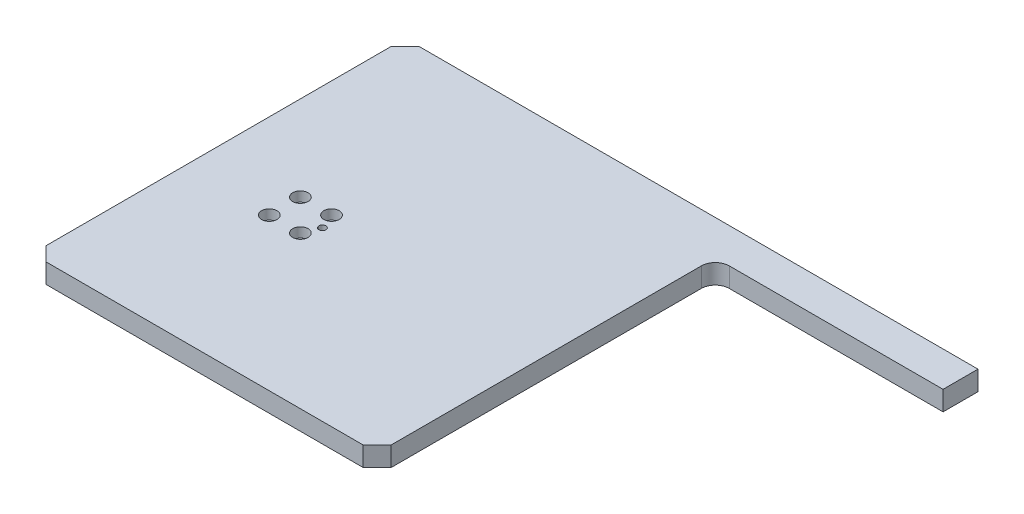
ISO-10303-21;
HEADER;
FILE_DESCRIPTION(('STEP AP214'),'2;1');
FILE_NAME('part.step','',(''),(''),'','','');
FILE_SCHEMA(('AUTOMOTIVE_DESIGN { 1 0 10303 214 1 1 1 1 }'));
ENDSEC;
DATA;
#1=APPLICATION_CONTEXT('core data for automotive mechanical design processes');
#2=APPLICATION_PROTOCOL_DEFINITION('international standard','automotive_design',2000,#1);
#3=PRODUCT_CONTEXT('',#1,'mechanical');
#4=PRODUCT('Part','Part','',(#3));
#5=PRODUCT_RELATED_PRODUCT_CATEGORY('part','',(#4));
#6=PRODUCT_DEFINITION_FORMATION('','',#4);
#7=PRODUCT_DEFINITION_CONTEXT('part definition',#1,'design');
#8=PRODUCT_DEFINITION('design','',#6,#7);
#9=PRODUCT_DEFINITION_SHAPE('','',#8);
#10=(LENGTH_UNIT() NAMED_UNIT(*) SI_UNIT(.MILLI.,.METRE.));
#11=(NAMED_UNIT(*) PLANE_ANGLE_UNIT() SI_UNIT($,.RADIAN.));
#12=(NAMED_UNIT(*) SI_UNIT($,.STERADIAN.) SOLID_ANGLE_UNIT());
#13=UNCERTAINTY_MEASURE_WITH_UNIT(LENGTH_MEASURE(1.E-05),#10,'distance_accuracy_value','');
#14=(GEOMETRIC_REPRESENTATION_CONTEXT(3) GLOBAL_UNCERTAINTY_ASSIGNED_CONTEXT((#13)) GLOBAL_UNIT_ASSIGNED_CONTEXT((#10,
#11,#12)) REPRESENTATION_CONTEXT('',''));
#15=CARTESIAN_POINT('',(0.,0.,0.));
#16=DIRECTION('',(0.,0.,1.));
#17=DIRECTION('',(1.,0.,0.));
#18=AXIS2_PLACEMENT_3D('',#15,#16,#17);
#19=CARTESIAN_POINT('',(337.94,14.,-122.));
#20=DIRECTION('',(0.,0.,-1.));
#21=DIRECTION('',(-1.,0.,0.));
#22=AXIS2_PLACEMENT_3D('',#19,#20,#21);
#23=PLANE('',#22);
#24=DIRECTION('',(1.,0.,0.));
#25=VECTOR('',#24,1.);
#26=CARTESIAN_POINT('',(337.94,0.,-122.));
#27=LINE('',#26,#25);
#28=CARTESIAN_POINT('',(184.94,0.,-122.));
#29=VERTEX_POINT('',#28);
#30=CARTESIAN_POINT('',(337.94,0.,-122.));
#31=VERTEX_POINT('',#30);
#32=EDGE_CURVE('E145',#29,#31,#27,.T.);
#33=ORIENTED_EDGE('',*,*,#32,.T.);
#34=DIRECTION('',(0.,-1.,0.));
#35=VECTOR('',#34,1.);
#36=CARTESIAN_POINT('',(337.94,14.,-122.));
#37=LINE('',#36,#35);
#38=CARTESIAN_POINT('',(337.94,14.,-122.));
#39=VERTEX_POINT('',#38);
#40=EDGE_CURVE('E11',#39,#31,#37,.T.);
#41=ORIENTED_EDGE('',*,*,#40,.F.);
#42=DIRECTION('',(1.,0.,0.));
#43=VECTOR('',#42,1.);
#44=CARTESIAN_POINT('',(337.94,14.,-122.));
#45=LINE('',#44,#43);
#46=CARTESIAN_POINT('',(184.94,14.,-122.));
#47=VERTEX_POINT('',#46);
#48=EDGE_CURVE('E164',#47,#39,#45,.T.);
#49=ORIENTED_EDGE('',*,*,#48,.F.);
#50=DIRECTION('',(0.,-1.,0.));
#51=VECTOR('',#50,1.);
#52=CARTESIAN_POINT('',(184.94,14.,-122.));
#53=LINE('',#52,#51);
#54=EDGE_CURVE('E141',#47,#29,#53,.T.);
#55=ORIENTED_EDGE('',*,*,#54,.T.);
#56=EDGE_LOOP('',(#33,#41,#49,#55));
#57=FACE_BOUND('',#56,.T.);
#58=ADVANCED_FACE('F35',(#57),#23,.F.);
#59=CARTESIAN_POINT('',(337.94,14.,-147.));
#60=DIRECTION('',(-1.,0.,0.));
#61=DIRECTION('',(0.,0.,1.));
#62=AXIS2_PLACEMENT_3D('',#59,#60,#61);
#63=PLANE('',#62);
#64=DIRECTION('',(0.,0.,-1.));
#65=VECTOR('',#64,1.);
#66=CARTESIAN_POINT('',(337.94,0.,-147.));
#67=LINE('',#66,#65);
#68=CARTESIAN_POINT('',(337.94,0.,-147.));
#69=VERTEX_POINT('',#68);
#70=EDGE_CURVE('E148',#31,#69,#67,.T.);
#71=ORIENTED_EDGE('',*,*,#70,.T.);
#72=DIRECTION('',(0.,-1.,0.));
#73=VECTOR('',#72,1.);
#74=CARTESIAN_POINT('',(337.94,14.,-147.));
#75=LINE('',#74,#73);
#76=CARTESIAN_POINT('',(337.94,14.,-147.));
#77=VERTEX_POINT('',#76);
#78=EDGE_CURVE('E44',#77,#69,#75,.T.);
#79=ORIENTED_EDGE('',*,*,#78,.F.);
#80=DIRECTION('',(0.,0.,-1.));
#81=VECTOR('',#80,1.);
#82=CARTESIAN_POINT('',(337.94,14.,-147.));
#83=LINE('',#82,#81);
#84=EDGE_CURVE('E102',#39,#77,#83,.T.);
#85=ORIENTED_EDGE('',*,*,#84,.F.);
#86=ORIENTED_EDGE('',*,*,#40,.T.);
#87=EDGE_LOOP('',(#71,#79,#85,#86));
#88=FACE_BOUND('',#87,.T.);
#89=ADVANCED_FACE('F263',(#88),#63,.F.);
#90=CARTESIAN_POINT('',(-62.06,14.,-147.));
#91=DIRECTION('',(0.,0.,1.));
#92=DIRECTION('',(1.,0.,0.));
#93=AXIS2_PLACEMENT_3D('',#90,#91,#92);
#94=PLANE('',#93);
#95=DIRECTION('',(-1.,0.,0.));
#96=VECTOR('',#95,1.);
#97=CARTESIAN_POINT('',(-62.06,0.,-147.));
#98=LINE('',#97,#96);
#99=CARTESIAN_POINT('',(-62.06,0.,-147.));
#100=VERTEX_POINT('',#99);
#101=EDGE_CURVE('E151',#69,#100,#98,.T.);
#102=ORIENTED_EDGE('',*,*,#101,.T.);
#103=DIRECTION('',(0.,-1.,0.));
#104=VECTOR('',#103,1.);
#105=CARTESIAN_POINT('',(-62.06,14.,-147.));
#106=LINE('',#105,#104);
#107=CARTESIAN_POINT('',(-62.06,14.,-147.));
#108=VERTEX_POINT('',#107);
#109=EDGE_CURVE('E177',#108,#100,#106,.T.);
#110=ORIENTED_EDGE('',*,*,#109,.F.);
#111=DIRECTION('',(-1.,0.,0.));
#112=VECTOR('',#111,1.);
#113=CARTESIAN_POINT('',(-62.06,14.,-147.));
#114=LINE('',#113,#112);
#115=EDGE_CURVE('E227',#77,#108,#114,.T.);
#116=ORIENTED_EDGE('',*,*,#115,.F.);
#117=ORIENTED_EDGE('',*,*,#78,.T.);
#118=EDGE_LOOP('',(#102,#110,#116,#117));
#119=FACE_BOUND('',#118,.T.);
#120=ADVANCED_FACE('F267',(#119),#94,.F.);
#121=CARTESIAN_POINT('',(-72.06,14.,-137.));
#122=DIRECTION('',(0.707106781186548,0.,0.707106781186547));
#123=DIRECTION('',(0.707106781186547,0.,-0.707106781186548));
#124=AXIS2_PLACEMENT_3D('',#121,#122,#123);
#125=PLANE('',#124);
#126=DIRECTION('',(-0.707106781186547,0.,0.707106781186548));
#127=VECTOR('',#126,1.);
#128=CARTESIAN_POINT('',(-72.06,0.,-137.));
#129=LINE('',#128,#127);
#130=CARTESIAN_POINT('',(-72.06,0.,-137.));
#131=VERTEX_POINT('',#130);
#132=EDGE_CURVE('E153',#100,#131,#129,.T.);
#133=ORIENTED_EDGE('',*,*,#132,.T.);
#134=DIRECTION('',(0.,-1.,0.));
#135=VECTOR('',#134,1.);
#136=CARTESIAN_POINT('',(-72.06,14.,-137.));
#137=LINE('',#136,#135);
#138=CARTESIAN_POINT('',(-72.06,14.,-137.));
#139=VERTEX_POINT('',#138);
#140=EDGE_CURVE('E174',#139,#131,#137,.T.);
#141=ORIENTED_EDGE('',*,*,#140,.F.);
#142=DIRECTION('',(-0.707106781186547,0.,0.707106781186548));
#143=VECTOR('',#142,1.);
#144=CARTESIAN_POINT('',(-72.06,14.,-137.));
#145=LINE('',#144,#143);
#146=EDGE_CURVE('E229',#108,#139,#145,.T.);
#147=ORIENTED_EDGE('',*,*,#146,.F.);
#148=ORIENTED_EDGE('',*,*,#109,.T.);
#149=EDGE_LOOP('',(#133,#141,#147,#148));
#150=FACE_BOUND('',#149,.T.);
#151=ADVANCED_FACE('F271',(#150),#125,.F.);
#152=CARTESIAN_POINT('',(-72.06,14.,-137.));
#153=DIRECTION('',(1.,0.,0.));
#154=DIRECTION('',(0.,0.,-1.));
#155=AXIS2_PLACEMENT_3D('',#152,#153,#154);
#156=PLANE('',#155);
#157=DIRECTION('',(0.,0.,1.));
#158=VECTOR('',#157,1.);
#159=CARTESIAN_POINT('',(-72.06,0.,-137.));
#160=LINE('',#159,#158);
#161=CARTESIAN_POINT('',(-72.06,0.,110.));
#162=VERTEX_POINT('',#161);
#163=EDGE_CURVE('E155',#131,#162,#160,.T.);
#164=ORIENTED_EDGE('',*,*,#163,.T.);
#165=DIRECTION('',(0.,-1.,0.));
#166=VECTOR('',#165,1.);
#167=CARTESIAN_POINT('',(-72.06,14.,110.));
#168=LINE('',#167,#166);
#169=CARTESIAN_POINT('',(-72.06,14.,110.));
#170=VERTEX_POINT('',#169);
#171=EDGE_CURVE('E171',#170,#162,#168,.T.);
#172=ORIENTED_EDGE('',*,*,#171,.F.);
#173=DIRECTION('',(0.,0.,1.));
#174=VECTOR('',#173,1.);
#175=CARTESIAN_POINT('',(-72.06,14.,-137.));
#176=LINE('',#175,#174);
#177=EDGE_CURVE('E231',#139,#170,#176,.T.);
#178=ORIENTED_EDGE('',*,*,#177,.F.);
#179=ORIENTED_EDGE('',*,*,#140,.T.);
#180=EDGE_LOOP('',(#164,#172,#178,#179));
#181=FACE_BOUND('',#180,.T.);
#182=ADVANCED_FACE('F277',(#181),#156,.F.);
#183=CARTESIAN_POINT('',(-72.06,14.,110.));
#184=DIRECTION('',(0.707106781186547,0.,-0.707106781186548));
#185=DIRECTION('',(-0.707106781186548,0.,-0.707106781186547));
#186=AXIS2_PLACEMENT_3D('',#183,#184,#185);
#187=PLANE('',#186);
#188=DIRECTION('',(0.707106781186548,0.,0.707106781186547));
#189=VECTOR('',#188,1.);
#190=CARTESIAN_POINT('',(-72.06,0.,110.));
#191=LINE('',#190,#189);
#192=CARTESIAN_POINT('',(-62.06,0.,120.));
#193=VERTEX_POINT('',#192);
#194=EDGE_CURVE('E157',#162,#193,#191,.T.);
#195=ORIENTED_EDGE('',*,*,#194,.T.);
#196=DIRECTION('',(0.,-1.,0.));
#197=VECTOR('',#196,1.);
#198=CARTESIAN_POINT('',(-62.06,14.,120.));
#199=LINE('',#198,#197);
#200=CARTESIAN_POINT('',(-62.06,14.,120.));
#201=VERTEX_POINT('',#200);
#202=EDGE_CURVE('E168',#201,#193,#199,.T.);
#203=ORIENTED_EDGE('',*,*,#202,.F.);
#204=DIRECTION('',(0.707106781186548,0.,0.707106781186547));
#205=VECTOR('',#204,1.);
#206=CARTESIAN_POINT('',(-72.06,14.,110.));
#207=LINE('',#206,#205);
#208=EDGE_CURVE('E233',#170,#201,#207,.T.);
#209=ORIENTED_EDGE('',*,*,#208,.F.);
#210=ORIENTED_EDGE('',*,*,#171,.T.);
#211=EDGE_LOOP('',(#195,#203,#209,#210));
#212=FACE_BOUND('',#211,.T.);
#213=ADVANCED_FACE('F239',(#212),#187,.F.);
#214=CARTESIAN_POINT('',(164.94,14.,120.));
#215=DIRECTION('',(0.,0.,-1.));
#216=DIRECTION('',(-1.,0.,0.));
#217=AXIS2_PLACEMENT_3D('',#214,#215,#216);
#218=PLANE('',#217);
#219=DIRECTION('',(1.,0.,0.));
#220=VECTOR('',#219,1.);
#221=CARTESIAN_POINT('',(164.94,0.,120.));
#222=LINE('',#221,#220);
#223=CARTESIAN_POINT('',(164.94,0.,120.));
#224=VERTEX_POINT('',#223);
#225=EDGE_CURVE('E159',#193,#224,#222,.T.);
#226=ORIENTED_EDGE('',*,*,#225,.T.);
#227=DIRECTION('',(0.,-1.,0.));
#228=VECTOR('',#227,1.);
#229=CARTESIAN_POINT('',(164.94,14.,120.));
#230=LINE('',#229,#228);
#231=CARTESIAN_POINT('',(164.94,14.,120.));
#232=VERTEX_POINT('',#231);
#233=EDGE_CURVE('E136',#232,#224,#230,.T.);
#234=ORIENTED_EDGE('',*,*,#233,.F.);
#235=DIRECTION('',(1.,0.,0.));
#236=VECTOR('',#235,1.);
#237=CARTESIAN_POINT('',(164.94,14.,120.));
#238=LINE('',#237,#236);
#239=EDGE_CURVE('E127',#201,#232,#238,.T.);
#240=ORIENTED_EDGE('',*,*,#239,.F.);
#241=ORIENTED_EDGE('',*,*,#202,.T.);
#242=EDGE_LOOP('',(#226,#234,#240,#241));
#243=FACE_BOUND('',#242,.T.);
#244=ADVANCED_FACE('F243',(#243),#218,.F.);
#245=CARTESIAN_POINT('',(174.94,14.,110.));
#246=DIRECTION('',(-0.707106781186548,0.,-0.707106781186548));
#247=DIRECTION('',(-0.707106781186548,0.,0.707106781186548));
#248=AXIS2_PLACEMENT_3D('',#245,#246,#247);
#249=PLANE('',#248);
#250=DIRECTION('',(0.707106781186547,0.,-0.707106781186547));
#251=VECTOR('',#250,1.);
#252=CARTESIAN_POINT('',(174.94,0.,110.));
#253=LINE('',#252,#251);
#254=CARTESIAN_POINT('',(174.94,0.,110.));
#255=VERTEX_POINT('',#254);
#256=EDGE_CURVE('E135',#224,#255,#253,.T.);
#257=ORIENTED_EDGE('',*,*,#256,.T.);
#258=DIRECTION('',(0.,-1.,0.));
#259=VECTOR('',#258,1.);
#260=CARTESIAN_POINT('',(174.94,14.,110.));
#261=LINE('',#260,#259);
#262=CARTESIAN_POINT('',(174.94,14.,110.));
#263=VERTEX_POINT('',#262);
#264=EDGE_CURVE('E132',#263,#255,#261,.T.);
#265=ORIENTED_EDGE('',*,*,#264,.F.);
#266=DIRECTION('',(0.707106781186547,0.,-0.707106781186547));
#267=VECTOR('',#266,1.);
#268=CARTESIAN_POINT('',(174.94,14.,110.));
#269=LINE('',#268,#267);
#270=EDGE_CURVE('E121',#232,#263,#269,.T.);
#271=ORIENTED_EDGE('',*,*,#270,.F.);
#272=ORIENTED_EDGE('',*,*,#233,.T.);
#273=EDGE_LOOP('',(#257,#265,#271,#272));
#274=FACE_BOUND('',#273,.T.);
#275=ADVANCED_FACE('F133',(#274),#249,.F.);
#276=CARTESIAN_POINT('',(174.94,14.,-112.));
#277=DIRECTION('',(-1.,0.,0.));
#278=DIRECTION('',(0.,0.,1.));
#279=AXIS2_PLACEMENT_3D('',#276,#277,#278);
#280=PLANE('',#279);
#281=DIRECTION('',(0.,0.,-1.));
#282=VECTOR('',#281,1.);
#283=CARTESIAN_POINT('',(174.94,0.,-112.));
#284=LINE('',#283,#282);
#285=CARTESIAN_POINT('',(174.94,0.,-112.));
#286=VERTEX_POINT('',#285);
#287=EDGE_CURVE('E88',#255,#286,#284,.T.);
#288=ORIENTED_EDGE('',*,*,#287,.T.);
#289=DIRECTION('',(0.,-1.,0.));
#290=VECTOR('',#289,1.);
#291=CARTESIAN_POINT('',(174.94,14.,-112.));
#292=LINE('',#291,#290);
#293=CARTESIAN_POINT('',(174.94,14.,-112.));
#294=VERTEX_POINT('',#293);
#295=EDGE_CURVE('E137',#294,#286,#292,.T.);
#296=ORIENTED_EDGE('',*,*,#295,.F.);
#297=DIRECTION('',(0.,0.,-1.));
#298=VECTOR('',#297,1.);
#299=CARTESIAN_POINT('',(174.94,14.,-112.));
#300=LINE('',#299,#298);
#301=EDGE_CURVE('E125',#263,#294,#300,.T.);
#302=ORIENTED_EDGE('',*,*,#301,.F.);
#303=ORIENTED_EDGE('',*,*,#264,.T.);
#304=EDGE_LOOP('',(#288,#296,#302,#303));
#305=FACE_BOUND('',#304,.T.);
#306=ADVANCED_FACE('F139',(#305),#280,.F.);
#307=CARTESIAN_POINT('',(184.94,14.,-112.));
#308=DIRECTION('',(0.,-1.,0.));
#309=DIRECTION('',(0.,0.,-1.));
#310=AXIS2_PLACEMENT_3D('',#307,#308,#309);
#311=CYLINDRICAL_SURFACE('',#310,9.99999999999998);
#312=CARTESIAN_POINT('',(184.94,0.,-112.));
#313=DIRECTION('',(0.,-1.,0.));
#314=DIRECTION('',(0.,0.,1.));
#315=AXIS2_PLACEMENT_3D('',#312,#313,#314);
#316=CIRCLE('',#315,9.99999999999998);
#317=EDGE_CURVE('E94',#286,#29,#316,.T.);
#318=ORIENTED_EDGE('',*,*,#317,.T.);
#319=ORIENTED_EDGE('',*,*,#54,.F.);
#320=CARTESIAN_POINT('',(184.94,14.,-112.));
#321=DIRECTION('',(0.,-1.,0.));
#322=DIRECTION('',(0.,0.,1.));
#323=AXIS2_PLACEMENT_3D('',#320,#321,#322);
#324=CIRCLE('',#323,9.99999999999998);
#325=EDGE_CURVE('E53',#294,#47,#324,.T.);
#326=ORIENTED_EDGE('',*,*,#325,.F.);
#327=ORIENTED_EDGE('',*,*,#295,.T.);
#328=EDGE_LOOP('',(#318,#319,#326,#327));
#329=FACE_BOUND('',#328,.T.);
#330=ADVANCED_FACE('F251',(#329),#311,.F.);
#331=CARTESIAN_POINT('',(184.94,14.,-112.));
#332=DIRECTION('',(0.,1.,0.));
#333=DIRECTION('',(0.,0.,1.));
#334=AXIS2_PLACEMENT_3D('',#331,#332,#333);
#335=PLANE('',#334);
#336=CARTESIAN_POINT('',(15.75,14.,0.));
#337=DIRECTION('',(0.,-1.,0.));
#338=DIRECTION('',(0.,0.,-1.));
#339=AXIS2_PLACEMENT_3D('',#336,#337,#338);
#340=CIRCLE('',#339,2.5);
#341=CARTESIAN_POINT('',(15.75,14.,-2.5));
#342=VERTEX_POINT('',#341);
#343=EDGE_CURVE('E469',#342,#342,#340,.T.);
#344=ORIENTED_EDGE('',*,*,#343,.T.);
#345=EDGE_LOOP('',(#344));
#346=FACE_BOUND('',#345,.T.);
#347=CARTESIAN_POINT('',(-11.1369318036881,14.,11.1369318036881));
#348=DIRECTION('',(0.,1.,0.));
#349=DIRECTION('',(0.,0.,1.));
#350=AXIS2_PLACEMENT_3D('',#347,#348,#349);
#351=CIRCLE('',#350,5.5000017);
#352=CARTESIAN_POINT('',(-11.1369318036881,14.,16.6369335036881));
#353=VERTEX_POINT('',#352);
#354=EDGE_CURVE('E474',#353,#353,#351,.T.);
#355=ORIENTED_EDGE('',*,*,#354,.F.);
#356=EDGE_LOOP('',(#355));
#357=FACE_BOUND('',#356,.T.);
#358=CARTESIAN_POINT('',(11.1369318036881,14.,11.1369318036881));
#359=DIRECTION('',(0.,1.,0.));
#360=DIRECTION('',(0.,0.,1.));
#361=AXIS2_PLACEMENT_3D('',#358,#359,#360);
#362=CIRCLE('',#361,5.5000017);
#363=CARTESIAN_POINT('',(11.1369318036881,14.,16.6369335036881));
#364=VERTEX_POINT('',#363);
#365=EDGE_CURVE('E206',#364,#364,#362,.T.);
#366=ORIENTED_EDGE('',*,*,#365,.F.);
#367=EDGE_LOOP('',(#366));
#368=FACE_BOUND('',#367,.T.);
#369=CARTESIAN_POINT('',(11.1369318036881,14.,-11.1369318036881));
#370=DIRECTION('',(0.,1.,0.));
#371=DIRECTION('',(0.,0.,1.));
#372=AXIS2_PLACEMENT_3D('',#369,#370,#371);
#373=CIRCLE('',#372,5.5000017);
#374=CARTESIAN_POINT('',(11.1369318036881,14.,-5.63693010368812));
#375=VERTEX_POINT('',#374);
#376=EDGE_CURVE('E193',#375,#375,#373,.T.);
#377=ORIENTED_EDGE('',*,*,#376,.F.);
#378=EDGE_LOOP('',(#377));
#379=FACE_BOUND('',#378,.T.);
#380=CARTESIAN_POINT('',(-11.1369318036881,14.,-11.1369318036881));
#381=DIRECTION('',(0.,1.,0.));
#382=DIRECTION('',(0.,0.,1.));
#383=AXIS2_PLACEMENT_3D('',#380,#381,#382);
#384=CIRCLE('',#383,5.5000017);
#385=CARTESIAN_POINT('',(-11.1369318036881,14.,-5.63693010368812));
#386=VERTEX_POINT('',#385);
#387=EDGE_CURVE('E189',#386,#386,#384,.T.);
#388=ORIENTED_EDGE('',*,*,#387,.F.);
#389=EDGE_LOOP('',(#388));
#390=FACE_BOUND('',#389,.T.);
#391=ORIENTED_EDGE('',*,*,#48,.T.);
#392=ORIENTED_EDGE('',*,*,#84,.T.);
#393=ORIENTED_EDGE('',*,*,#115,.T.);
#394=ORIENTED_EDGE('',*,*,#146,.T.);
#395=ORIENTED_EDGE('',*,*,#177,.T.);
#396=ORIENTED_EDGE('',*,*,#208,.T.);
#397=ORIENTED_EDGE('',*,*,#239,.T.);
#398=ORIENTED_EDGE('',*,*,#270,.T.);
#399=ORIENTED_EDGE('',*,*,#301,.T.);
#400=ORIENTED_EDGE('',*,*,#325,.T.);
#401=EDGE_LOOP('',(#391,#392,#393,#394,#395,#396,#397,#398,#399,#400));
#402=FACE_BOUND('',#401,.T.);
#403=ADVANCED_FACE('F123',(#346,#357,#368,#379,#390,#402),#335,.T.);
#404=CARTESIAN_POINT('',(184.94,0.,-112.));
#405=DIRECTION('',(0.,1.,0.));
#406=DIRECTION('',(0.,0.,1.));
#407=AXIS2_PLACEMENT_3D('',#404,#405,#406);
#408=PLANE('',#407);
#409=CARTESIAN_POINT('',(0.,0.,0.));
#410=DIRECTION('',(0.,1.,0.));
#411=DIRECTION('',(0.,0.,1.));
#412=AXIS2_PLACEMENT_3D('',#409,#410,#411);
#413=CIRCLE('',#412,20.);
#414=CARTESIAN_POINT('',(0.,0.,-20.));
#415=VERTEX_POINT('',#414);
#416=EDGE_CURVE('E185',#415,#415,#413,.T.);
#417=ORIENTED_EDGE('',*,*,#416,.T.);
#418=EDGE_LOOP('',(#417));
#419=FACE_BOUND('',#418,.T.);
#420=ORIENTED_EDGE('',*,*,#32,.F.);
#421=ORIENTED_EDGE('',*,*,#317,.F.);
#422=ORIENTED_EDGE('',*,*,#287,.F.);
#423=ORIENTED_EDGE('',*,*,#256,.F.);
#424=ORIENTED_EDGE('',*,*,#225,.F.);
#425=ORIENTED_EDGE('',*,*,#194,.F.);
#426=ORIENTED_EDGE('',*,*,#163,.F.);
#427=ORIENTED_EDGE('',*,*,#132,.F.);
#428=ORIENTED_EDGE('',*,*,#101,.F.);
#429=ORIENTED_EDGE('',*,*,#70,.F.);
#430=EDGE_LOOP('',(#420,#421,#422,#423,#424,#425,#426,#427,#428,#429));
#431=FACE_BOUND('',#430,.T.);
#432=ADVANCED_FACE('F246',(#419,#431),#408,.F.);
#433=CARTESIAN_POINT('',(0.,2.28,0.));
#434=DIRECTION('',(0.,-1.,0.));
#435=DIRECTION('',(0.,0.,-1.));
#436=AXIS2_PLACEMENT_3D('',#433,#434,#435);
#437=CYLINDRICAL_SURFACE('',#436,20.);
#438=CARTESIAN_POINT('',(0.,2.28,0.));
#439=DIRECTION('',(0.,1.,0.));
#440=DIRECTION('',(0.,0.,1.));
#441=AXIS2_PLACEMENT_3D('',#438,#439,#440);
#442=CIRCLE('',#441,20.);
#443=CARTESIAN_POINT('',(0.,2.28,-20.));
#444=VERTEX_POINT('',#443);
#445=EDGE_CURVE('E149',#444,#444,#442,.T.);
#446=CARTESIAN_POINT('',(0.,2.28,-20.));
#447=CARTESIAN_POINT('',(0.,2.25625,-20.));
#448=CARTESIAN_POINT('',(0.,2.2325,-20.));
#449=CARTESIAN_POINT('',(0.,2.185,-20.));
#450=CARTESIAN_POINT('',(0.,2.16125,-20.));
#451=CARTESIAN_POINT('',(0.,2.11375,-20.));
#452=CARTESIAN_POINT('',(0.,2.09,-20.));
#453=CARTESIAN_POINT('',(0.,2.0425,-20.));
#454=CARTESIAN_POINT('',(0.,2.01875,-20.));
#455=CARTESIAN_POINT('',(0.,1.97125,-20.));
#456=CARTESIAN_POINT('',(0.,1.9475,-20.));
#457=CARTESIAN_POINT('',(0.,1.9,-20.));
#458=CARTESIAN_POINT('',(0.,1.87625,-20.));
#459=CARTESIAN_POINT('',(0.,1.82875,-20.));
#460=CARTESIAN_POINT('',(0.,1.805,-20.));
#461=CARTESIAN_POINT('',(0.,1.7575,-20.));
#462=CARTESIAN_POINT('',(0.,1.73375,-20.));
#463=CARTESIAN_POINT('',(0.,1.68625,-20.));
#464=CARTESIAN_POINT('',(0.,1.6625,-20.));
#465=CARTESIAN_POINT('',(0.,1.615,-20.));
#466=CARTESIAN_POINT('',(0.,1.59125,-20.));
#467=CARTESIAN_POINT('',(0.,1.54375,-20.));
#468=CARTESIAN_POINT('',(0.,1.52,-20.));
#469=CARTESIAN_POINT('',(0.,1.4725,-20.));
#470=CARTESIAN_POINT('',(0.,1.44875,-20.));
#471=CARTESIAN_POINT('',(0.,1.40125,-20.));
#472=CARTESIAN_POINT('',(0.,1.3775,-20.));
#473=CARTESIAN_POINT('',(0.,1.33,-20.));
#474=CARTESIAN_POINT('',(0.,1.30625,-20.));
#475=CARTESIAN_POINT('',(0.,1.25875,-20.));
#476=CARTESIAN_POINT('',(0.,1.235,-20.));
#477=CARTESIAN_POINT('',(0.,1.1875,-20.));
#478=CARTESIAN_POINT('',(0.,1.16375,-20.));
#479=CARTESIAN_POINT('',(0.,1.11625,-20.));
#480=CARTESIAN_POINT('',(0.,1.0925,-20.));
#481=CARTESIAN_POINT('',(0.,1.045,-20.));
#482=CARTESIAN_POINT('',(0.,1.02125,-20.));
#483=CARTESIAN_POINT('',(0.,0.97375,-20.));
#484=CARTESIAN_POINT('',(0.,0.95,-20.));
#485=CARTESIAN_POINT('',(0.,0.9025,-20.));
#486=CARTESIAN_POINT('',(0.,0.87875,-20.));
#487=CARTESIAN_POINT('',(0.,0.83125,-20.));
#488=CARTESIAN_POINT('',(0.,0.8075,-20.));
#489=CARTESIAN_POINT('',(0.,0.76,-20.));
#490=CARTESIAN_POINT('',(0.,0.73625,-20.));
#491=CARTESIAN_POINT('',(0.,0.68875,-20.));
#492=CARTESIAN_POINT('',(0.,0.665,-20.));
#493=CARTESIAN_POINT('',(0.,0.6175,-20.));
#494=CARTESIAN_POINT('',(0.,0.59375,-20.));
#495=CARTESIAN_POINT('',(0.,0.54625,-20.));
#496=CARTESIAN_POINT('',(0.,0.5225,-20.));
#497=CARTESIAN_POINT('',(0.,0.475,-20.));
#498=CARTESIAN_POINT('',(0.,0.45125,-20.));
#499=CARTESIAN_POINT('',(0.,0.40375,-20.));
#500=CARTESIAN_POINT('',(0.,0.38,-20.));
#501=CARTESIAN_POINT('',(0.,0.3325,-20.));
#502=CARTESIAN_POINT('',(0.,0.30875,-20.));
#503=CARTESIAN_POINT('',(0.,0.26125,-20.));
#504=CARTESIAN_POINT('',(0.,0.2375,-20.));
#505=CARTESIAN_POINT('',(0.,0.19,-20.));
#506=CARTESIAN_POINT('',(0.,0.16625,-20.));
#507=CARTESIAN_POINT('',(0.,0.11875,-20.));
#508=CARTESIAN_POINT('',(0.,0.095,-20.));
#509=CARTESIAN_POINT('',(0.,0.0475000000000001,-20.));
#510=CARTESIAN_POINT('',(0.,0.0237500000000001,-20.));
#511=CARTESIAN_POINT('',(0.,0.,-20.));
#512=B_SPLINE_CURVE_WITH_KNOTS('',3,(#446,#447,#448,#449,#450,#451,#452,#453,#454,#455,#456,
#457,#458,#459,#460,#461,#462,#463,#464,#465,#466,#467,#468,#469,#470,#471,#472,#473,#474,#475,
#476,#477,#478,#479,#480,#481,#482,#483,#484,#485,#486,#487,#488,#489,#490,#491,#492,#493,#494,
#495,#496,#497,#498,#499,#500,#501,#502,#503,#504,#505,#506,#507,#508,#509,#510,#511),
.UNSPECIFIED.,.F.,.F.,(4,2,2,2,2,2,2,2,2,2,2,2,2,2,2,2,2,2,2,2,2,2,2,2,2,2,2,2,2,2,2,2,4),(0.,
0.0712499999999997,0.1425,0.21375,0.285,0.35625,0.4275,0.49875,0.57,0.641249999999999,0.7125,
0.78375,0.854999999999999,0.92625,0.997499999999999,1.06875,1.14,1.21125,1.2825,1.35375,1.425,
1.49625,1.5675,1.63875,1.71,1.78125,1.8525,1.92375,1.995,2.06625,2.1375,2.20875,2.28),.UNSPECIFIED.);
#513=EDGE_CURVE('BSEAM309',#444,#415,#512,.T.);
#514=ORIENTED_EDGE('',*,*,#445,.T.);
#515=ORIENTED_EDGE('',*,*,#416,.F.);
#516=ORIENTED_EDGE('',*,*,#513,.T.);
#517=ORIENTED_EDGE('',*,*,#513,.F.);
#518=EDGE_LOOP('',(#514,#516,#515,#517));
#519=FACE_BOUND('',#518,.T.);
#520=ADVANCED_FACE('F309',(#519),#437,.F.);
#521=CARTESIAN_POINT('',(0.,2.28,0.));
#522=DIRECTION('',(0.,1.,0.));
#523=DIRECTION('',(0.,0.,1.));
#524=AXIS2_PLACEMENT_3D('',#521,#522,#523);
#525=PLANE('',#524);
#526=CARTESIAN_POINT('',(15.75,2.28,0.));
#527=DIRECTION('',(0.,-1.,0.));
#528=DIRECTION('',(0.,0.,-1.));
#529=AXIS2_PLACEMENT_3D('',#526,#527,#528);
#530=CIRCLE('',#529,2.5);
#531=CARTESIAN_POINT('',(15.75,2.28,-2.5));
#532=VERTEX_POINT('',#531);
#533=EDGE_CURVE('E472',#532,#532,#530,.T.);
#534=ORIENTED_EDGE('',*,*,#533,.F.);
#535=EDGE_LOOP('',(#534));
#536=FACE_BOUND('',#535,.T.);
#537=CARTESIAN_POINT('',(-11.1369318036881,2.28,11.1369318036881));
#538=DIRECTION('',(0.,1.,0.));
#539=DIRECTION('',(0.,0.,1.));
#540=AXIS2_PLACEMENT_3D('',#537,#538,#539);
#541=CIRCLE('',#540,2.2499955);
#542=CARTESIAN_POINT('',(-11.1369318036881,2.28,13.3869273036881));
#543=VERTEX_POINT('',#542);
#544=EDGE_CURVE('E38',#543,#543,#541,.T.);
#545=ORIENTED_EDGE('',*,*,#544,.T.);
#546=EDGE_LOOP('',(#545));
#547=FACE_BOUND('',#546,.T.);
#548=CARTESIAN_POINT('',(11.1369318036881,2.28,11.1369318036881));
#549=DIRECTION('',(0.,1.,0.));
#550=DIRECTION('',(0.,0.,1.));
#551=AXIS2_PLACEMENT_3D('',#548,#549,#550);
#552=CIRCLE('',#551,2.2499955);
#553=CARTESIAN_POINT('',(11.1369318036881,2.28,13.3869273036881));
#554=VERTEX_POINT('',#553);
#555=EDGE_CURVE('E191',#554,#554,#552,.T.);
#556=ORIENTED_EDGE('',*,*,#555,.T.);
#557=EDGE_LOOP('',(#556));
#558=FACE_BOUND('',#557,.T.);
#559=CARTESIAN_POINT('',(11.1369318036881,2.28,-11.1369318036881));
#560=DIRECTION('',(0.,1.,0.));
#561=DIRECTION('',(0.,0.,1.));
#562=AXIS2_PLACEMENT_3D('',#559,#560,#561);
#563=CIRCLE('',#562,2.2499955);
#564=CARTESIAN_POINT('',(11.1369318036881,2.28,-8.88693630368812));
#565=VERTEX_POINT('',#564);
#566=EDGE_CURVE('E187',#565,#565,#563,.T.);
#567=ORIENTED_EDGE('',*,*,#566,.T.);
#568=EDGE_LOOP('',(#567));
#569=FACE_BOUND('',#568,.T.);
#570=CARTESIAN_POINT('',(-11.1369318036881,2.28,-11.1369318036881));
#571=DIRECTION('',(0.,1.,0.));
#572=DIRECTION('',(0.,0.,1.));
#573=AXIS2_PLACEMENT_3D('',#570,#571,#572);
#574=CIRCLE('',#573,2.2499955);
#575=CARTESIAN_POINT('',(-11.1369318036881,2.28,-8.88693630368812));
#576=VERTEX_POINT('',#575);
#577=EDGE_CURVE('E182',#576,#576,#574,.T.);
#578=ORIENTED_EDGE('',*,*,#577,.T.);
#579=EDGE_LOOP('',(#578));
#580=FACE_BOUND('',#579,.T.);
#581=ORIENTED_EDGE('',*,*,#445,.F.);
#582=EDGE_LOOP('',(#581));
#583=FACE_BOUND('',#582,.T.);
#584=ADVANCED_FACE('F318',(#536,#547,#558,#569,#580,#583),#525,.F.);
#585=CARTESIAN_POINT('',(-11.1369318036881,14.,-11.1369318036881));
#586=DIRECTION('',(0.,1.,0.));
#587=DIRECTION('',(0.,0.,1.));
#588=AXIS2_PLACEMENT_3D('',#585,#586,#587);
#589=CYLINDRICAL_SURFACE('',#588,2.2499955);
#590=CARTESIAN_POINT('',(-11.1369318036881,6.9999886,-11.1369318036881));
#591=DIRECTION('',(0.,1.,0.));
#592=DIRECTION('',(0.,0.,1.));
#593=AXIS2_PLACEMENT_3D('',#590,#591,#592);
#594=CIRCLE('',#593,2.2499955);
#595=CARTESIAN_POINT('',(-11.1369318036881,6.9999886,-8.88693630368812));
#596=VERTEX_POINT('',#595);
#597=EDGE_CURVE('E186',#596,#596,#594,.T.);
#598=ORIENTED_EDGE('',*,*,#597,.T.);
#599=EDGE_LOOP('',(#598));
#600=FACE_BOUND('',#599,.T.);
#601=ORIENTED_EDGE('',*,*,#577,.F.);
#602=EDGE_LOOP('',(#601));
#603=FACE_BOUND('',#602,.T.);
#604=ADVANCED_FACE('F326',(#600,#603),#589,.F.);
#605=CARTESIAN_POINT('',(-8.88693630368812,6.9999886,-11.1369318036881));
#606=DIRECTION('',(0.,-1.,0.));
#607=DIRECTION('',(0.,0.,-1.));
#608=AXIS2_PLACEMENT_3D('',#605,#606,#607);
#609=PLANE('',#608);
#610=ORIENTED_EDGE('',*,*,#597,.F.);
#611=EDGE_LOOP('',(#610));
#612=FACE_BOUND('',#611,.T.);
#613=CARTESIAN_POINT('',(-11.1369318036881,6.9999886,-11.1369318036881));
#614=DIRECTION('',(0.,1.,0.));
#615=DIRECTION('',(0.,0.,1.));
#616=AXIS2_PLACEMENT_3D('',#613,#614,#615);
#617=CIRCLE('',#616,5.5000017);
#618=CARTESIAN_POINT('',(-11.1369318036881,6.9999886,-5.63693010368812));
#619=VERTEX_POINT('',#618);
#620=EDGE_CURVE('E216',#619,#619,#617,.T.);
#621=ORIENTED_EDGE('',*,*,#620,.T.);
#622=EDGE_LOOP('',(#621));
#623=FACE_BOUND('',#622,.T.);
#624=ADVANCED_FACE('F331',(#612,#623),#609,.F.);
#625=CARTESIAN_POINT('',(-11.1369318036881,14.,-11.1369318036881));
#626=DIRECTION('',(0.,1.,0.));
#627=DIRECTION('',(0.,0.,1.));
#628=AXIS2_PLACEMENT_3D('',#625,#626,#627);
#629=CYLINDRICAL_SURFACE('',#628,5.5000017);
#630=ORIENTED_EDGE('',*,*,#620,.F.);
#631=EDGE_LOOP('',(#630));
#632=FACE_BOUND('',#631,.T.);
#633=ORIENTED_EDGE('',*,*,#387,.T.);
#634=EDGE_LOOP('',(#633));
#635=FACE_BOUND('',#634,.T.);
#636=ADVANCED_FACE('F341',(#632,#635),#629,.F.);
#637=CARTESIAN_POINT('',(11.1369318036881,14.,-11.1369318036881));
#638=DIRECTION('',(0.,1.,0.));
#639=DIRECTION('',(0.,0.,1.));
#640=AXIS2_PLACEMENT_3D('',#637,#638,#639);
#641=CYLINDRICAL_SURFACE('',#640,2.2499955);
#642=CARTESIAN_POINT('',(11.1369318036881,6.9999886,-11.1369318036881));
#643=DIRECTION('',(0.,1.,0.));
#644=DIRECTION('',(0.,0.,1.));
#645=AXIS2_PLACEMENT_3D('',#642,#643,#644);
#646=CIRCLE('',#645,2.2499955);
#647=CARTESIAN_POINT('',(11.1369318036881,6.9999886,-8.88693630368812));
#648=VERTEX_POINT('',#647);
#649=EDGE_CURVE('E190',#648,#648,#646,.T.);
#650=ORIENTED_EDGE('',*,*,#649,.T.);
#651=EDGE_LOOP('',(#650));
#652=FACE_BOUND('',#651,.T.);
#653=ORIENTED_EDGE('',*,*,#566,.F.);
#654=EDGE_LOOP('',(#653));
#655=FACE_BOUND('',#654,.T.);
#656=ADVANCED_FACE('F351',(#652,#655),#641,.F.);
#657=CARTESIAN_POINT('',(13.3869273036881,6.9999886,-11.1369318036881));
#658=DIRECTION('',(0.,-1.,0.));
#659=DIRECTION('',(0.,0.,-1.));
#660=AXIS2_PLACEMENT_3D('',#657,#658,#659);
#661=PLANE('',#660);
#662=ORIENTED_EDGE('',*,*,#649,.F.);
#663=EDGE_LOOP('',(#662));
#664=FACE_BOUND('',#663,.T.);
#665=CARTESIAN_POINT('',(11.1369318036881,6.9999886,-11.1369318036881));
#666=DIRECTION('',(0.,1.,0.));
#667=DIRECTION('',(0.,0.,1.));
#668=AXIS2_PLACEMENT_3D('',#665,#666,#667);
#669=CIRCLE('',#668,5.5000017);
#670=CARTESIAN_POINT('',(11.1369318036881,6.9999886,-5.63693010368812));
#671=VERTEX_POINT('',#670);
#672=EDGE_CURVE('E198',#671,#671,#669,.T.);
#673=ORIENTED_EDGE('',*,*,#672,.T.);
#674=EDGE_LOOP('',(#673));
#675=FACE_BOUND('',#674,.T.);
#676=ADVANCED_FACE('F361',(#664,#675),#661,.F.);
#677=CARTESIAN_POINT('',(11.1369318036881,14.,-11.1369318036881));
#678=DIRECTION('',(0.,1.,0.));
#679=DIRECTION('',(0.,0.,1.));
#680=AXIS2_PLACEMENT_3D('',#677,#678,#679);
#681=CYLINDRICAL_SURFACE('',#680,5.5000017);
#682=ORIENTED_EDGE('',*,*,#672,.F.);
#683=EDGE_LOOP('',(#682));
#684=FACE_BOUND('',#683,.T.);
#685=ORIENTED_EDGE('',*,*,#376,.T.);
#686=EDGE_LOOP('',(#685));
#687=FACE_BOUND('',#686,.T.);
#688=ADVANCED_FACE('F371',(#684,#687),#681,.F.);
#689=CARTESIAN_POINT('',(11.1369318036881,14.,11.1369318036881));
#690=DIRECTION('',(0.,1.,0.));
#691=DIRECTION('',(0.,0.,1.));
#692=AXIS2_PLACEMENT_3D('',#689,#690,#691);
#693=CYLINDRICAL_SURFACE('',#692,2.2499955);
#694=CARTESIAN_POINT('',(11.1369318036881,6.9999886,11.1369318036881));
#695=DIRECTION('',(0.,1.,0.));
#696=DIRECTION('',(0.,0.,1.));
#697=AXIS2_PLACEMENT_3D('',#694,#695,#696);
#698=CIRCLE('',#697,2.2499955);
#699=CARTESIAN_POINT('',(11.1369318036881,6.9999886,13.3869273036881));
#700=VERTEX_POINT('',#699);
#701=EDGE_CURVE('E194',#700,#700,#698,.T.);
#702=ORIENTED_EDGE('',*,*,#701,.T.);
#703=EDGE_LOOP('',(#702));
#704=FACE_BOUND('',#703,.T.);
#705=ORIENTED_EDGE('',*,*,#555,.F.);
#706=EDGE_LOOP('',(#705));
#707=FACE_BOUND('',#706,.T.);
#708=ADVANCED_FACE('F381',(#704,#707),#693,.F.);
#709=CARTESIAN_POINT('',(13.3869273036881,6.9999886,11.1369318036881));
#710=DIRECTION('',(0.,-1.,0.));
#711=DIRECTION('',(0.,0.,-1.));
#712=AXIS2_PLACEMENT_3D('',#709,#710,#711);
#713=PLANE('',#712);
#714=ORIENTED_EDGE('',*,*,#701,.F.);
#715=EDGE_LOOP('',(#714));
#716=FACE_BOUND('',#715,.T.);
#717=CARTESIAN_POINT('',(11.1369318036881,6.9999886,11.1369318036881));
#718=DIRECTION('',(0.,1.,0.));
#719=DIRECTION('',(0.,0.,1.));
#720=AXIS2_PLACEMENT_3D('',#717,#718,#719);
#721=CIRCLE('',#720,5.5000017);
#722=CARTESIAN_POINT('',(11.1369318036881,6.9999886,16.6369335036881));
#723=VERTEX_POINT('',#722);
#724=EDGE_CURVE('E201',#723,#723,#721,.T.);
#725=ORIENTED_EDGE('',*,*,#724,.T.);
#726=EDGE_LOOP('',(#725));
#727=FACE_BOUND('',#726,.T.);
#728=ADVANCED_FACE('F391',(#716,#727),#713,.F.);
#729=CARTESIAN_POINT('',(11.1369318036881,14.,11.1369318036881));
#730=DIRECTION('',(0.,1.,0.));
#731=DIRECTION('',(0.,0.,1.));
#732=AXIS2_PLACEMENT_3D('',#729,#730,#731);
#733=CYLINDRICAL_SURFACE('',#732,5.5000017);
#734=ORIENTED_EDGE('',*,*,#724,.F.);
#735=EDGE_LOOP('',(#734));
#736=FACE_BOUND('',#735,.T.);
#737=ORIENTED_EDGE('',*,*,#365,.T.);
#738=EDGE_LOOP('',(#737));
#739=FACE_BOUND('',#738,.T.);
#740=ADVANCED_FACE('F400',(#736,#739),#733,.F.);
#741=CARTESIAN_POINT('',(-11.1369318036881,14.,11.1369318036881));
#742=DIRECTION('',(0.,1.,0.));
#743=DIRECTION('',(0.,0.,1.));
#744=AXIS2_PLACEMENT_3D('',#741,#742,#743);
#745=CYLINDRICAL_SURFACE('',#744,2.2499955);
#746=CARTESIAN_POINT('',(-11.1369318036881,6.9999886,11.1369318036881));
#747=DIRECTION('',(0.,1.,0.));
#748=DIRECTION('',(0.,0.,1.));
#749=AXIS2_PLACEMENT_3D('',#746,#747,#748);
#750=CIRCLE('',#749,2.2499955);
#751=CARTESIAN_POINT('',(-11.1369318036881,6.9999886,13.3869273036881));
#752=VERTEX_POINT('',#751);
#753=EDGE_CURVE('E482',#752,#752,#750,.T.);
#754=ORIENTED_EDGE('',*,*,#753,.T.);
#755=EDGE_LOOP('',(#754));
#756=FACE_BOUND('',#755,.T.);
#757=ORIENTED_EDGE('',*,*,#544,.F.);
#758=EDGE_LOOP('',(#757));
#759=FACE_BOUND('',#758,.T.);
#760=ADVANCED_FACE('F410',(#756,#759),#745,.F.);
#761=CARTESIAN_POINT('',(-8.88693630368812,6.9999886,11.1369318036881));
#762=DIRECTION('',(0.,-1.,0.));
#763=DIRECTION('',(0.,0.,-1.));
#764=AXIS2_PLACEMENT_3D('',#761,#762,#763);
#765=PLANE('',#764);
#766=ORIENTED_EDGE('',*,*,#753,.F.);
#767=EDGE_LOOP('',(#766));
#768=FACE_BOUND('',#767,.T.);
#769=CARTESIAN_POINT('',(-11.1369318036881,6.9999886,11.1369318036881));
#770=DIRECTION('',(0.,1.,0.));
#771=DIRECTION('',(0.,0.,1.));
#772=AXIS2_PLACEMENT_3D('',#769,#770,#771);
#773=CIRCLE('',#772,5.5000017);
#774=CARTESIAN_POINT('',(-11.1369318036881,6.9999886,16.6369335036881));
#775=VERTEX_POINT('',#774);
#776=EDGE_CURVE('E479',#775,#775,#773,.T.);
#777=ORIENTED_EDGE('',*,*,#776,.T.);
#778=EDGE_LOOP('',(#777));
#779=FACE_BOUND('',#778,.T.);
#780=ADVANCED_FACE('F420',(#768,#779),#765,.F.);
#781=CARTESIAN_POINT('',(-11.1369318036881,14.,11.1369318036881));
#782=DIRECTION('',(0.,1.,0.));
#783=DIRECTION('',(0.,0.,1.));
#784=AXIS2_PLACEMENT_3D('',#781,#782,#783);
#785=CYLINDRICAL_SURFACE('',#784,5.5000017);
#786=ORIENTED_EDGE('',*,*,#776,.F.);
#787=EDGE_LOOP('',(#786));
#788=FACE_BOUND('',#787,.T.);
#789=ORIENTED_EDGE('',*,*,#354,.T.);
#790=EDGE_LOOP('',(#789));
#791=FACE_BOUND('',#790,.T.);
#792=ADVANCED_FACE('F430',(#788,#791),#785,.F.);
#793=CARTESIAN_POINT('',(15.75,14.,0.));
#794=DIRECTION('',(0.,-1.,0.));
#795=DIRECTION('',(0.,0.,-1.));
#796=AXIS2_PLACEMENT_3D('',#793,#794,#795);
#797=CYLINDRICAL_SURFACE('',#796,2.5);
#798=CARTESIAN_POINT('',(15.75,14.,-2.5));
#799=CARTESIAN_POINT('',(15.75,13.8779166666667,-2.5));
#800=CARTESIAN_POINT('',(15.75,13.7558333333333,-2.5));
#801=CARTESIAN_POINT('',(15.75,13.5116666666667,-2.5));
#802=CARTESIAN_POINT('',(15.75,13.3895833333333,-2.5));
#803=CARTESIAN_POINT('',(15.75,13.1454166666667,-2.5));
#804=CARTESIAN_POINT('',(15.75,13.0233333333333,-2.5));
#805=CARTESIAN_POINT('',(15.75,12.7791666666667,-2.5));
#806=CARTESIAN_POINT('',(15.75,12.6570833333333,-2.5));
#807=CARTESIAN_POINT('',(15.75,12.4129166666667,-2.5));
#808=CARTESIAN_POINT('',(15.75,12.2908333333333,-2.5));
#809=CARTESIAN_POINT('',(15.75,12.0466666666667,-2.5));
#810=CARTESIAN_POINT('',(15.75,11.9245833333333,-2.5));
#811=CARTESIAN_POINT('',(15.75,11.6804166666667,-2.5));
#812=CARTESIAN_POINT('',(15.75,11.5583333333333,-2.5));
#813=CARTESIAN_POINT('',(15.75,11.3141666666667,-2.5));
#814=CARTESIAN_POINT('',(15.75,11.1920833333333,-2.5));
#815=CARTESIAN_POINT('',(15.75,10.9479166666667,-2.5));
#816=CARTESIAN_POINT('',(15.75,10.8258333333333,-2.5));
#817=CARTESIAN_POINT('',(15.75,10.5816666666667,-2.5));
#818=CARTESIAN_POINT('',(15.75,10.4595833333333,-2.5));
#819=CARTESIAN_POINT('',(15.75,10.2154166666667,-2.5));
#820=CARTESIAN_POINT('',(15.75,10.0933333333333,-2.5));
#821=CARTESIAN_POINT('',(15.75,9.84916666666667,-2.5));
#822=CARTESIAN_POINT('',(15.75,9.72708333333334,-2.5));
#823=CARTESIAN_POINT('',(15.75,9.48291666666667,-2.5));
#824=CARTESIAN_POINT('',(15.75,9.36083333333333,-2.5));
#825=CARTESIAN_POINT('',(15.75,9.11666666666667,-2.5));
#826=CARTESIAN_POINT('',(15.75,8.99458333333333,-2.5));
#827=CARTESIAN_POINT('',(15.75,8.75041666666667,-2.5));
#828=CARTESIAN_POINT('',(15.75,8.62833333333334,-2.5));
#829=CARTESIAN_POINT('',(15.75,8.38416666666667,-2.5));
#830=CARTESIAN_POINT('',(15.75,8.26208333333333,-2.5));
#831=CARTESIAN_POINT('',(15.75,8.01791666666667,-2.5));
#832=CARTESIAN_POINT('',(15.75,7.89583333333333,-2.5));
#833=CARTESIAN_POINT('',(15.75,7.65166666666667,-2.5));
#834=CARTESIAN_POINT('',(15.75,7.52958333333333,-2.5));
#835=CARTESIAN_POINT('',(15.75,7.28541666666667,-2.5));
#836=CARTESIAN_POINT('',(15.75,7.16333333333333,-2.5));
#837=CARTESIAN_POINT('',(15.75,6.91916666666667,-2.5));
#838=CARTESIAN_POINT('',(15.75,6.79708333333333,-2.5));
#839=CARTESIAN_POINT('',(15.75,6.55291666666667,-2.5));
#840=CARTESIAN_POINT('',(15.75,6.43083333333333,-2.5));
#841=CARTESIAN_POINT('',(15.75,6.18666666666667,-2.5));
#842=CARTESIAN_POINT('',(15.75,6.06458333333333,-2.5));
#843=CARTESIAN_POINT('',(15.75,5.82041666666667,-2.5));
#844=CARTESIAN_POINT('',(15.75,5.69833333333334,-2.5));
#845=CARTESIAN_POINT('',(15.75,5.45416666666667,-2.5));
#846=CARTESIAN_POINT('',(15.75,5.33208333333333,-2.5));
#847=CARTESIAN_POINT('',(15.75,5.08791666666667,-2.5));
#848=CARTESIAN_POINT('',(15.75,4.96583333333333,-2.5));
#849=CARTESIAN_POINT('',(15.75,4.72166666666667,-2.5));
#850=CARTESIAN_POINT('',(15.75,4.59958333333333,-2.5));
#851=CARTESIAN_POINT('',(15.75,4.35541666666667,-2.5));
#852=CARTESIAN_POINT('',(15.75,4.23333333333333,-2.5));
#853=CARTESIAN_POINT('',(15.75,3.98916666666667,-2.5));
#854=CARTESIAN_POINT('',(15.75,3.86708333333333,-2.5));
#855=CARTESIAN_POINT('',(15.75,3.62291666666667,-2.5));
#856=CARTESIAN_POINT('',(15.75,3.50083333333333,-2.5));
#857=CARTESIAN_POINT('',(15.75,3.25666666666667,-2.5));
#858=CARTESIAN_POINT('',(15.75,3.13458333333333,-2.5));
#859=CARTESIAN_POINT('',(15.75,2.89041666666667,-2.5));
#860=CARTESIAN_POINT('',(15.75,2.76833333333333,-2.5));
#861=CARTESIAN_POINT('',(15.75,2.52416666666667,-2.5));
#862=CARTESIAN_POINT('',(15.75,2.40208333333333,-2.5));
#863=CARTESIAN_POINT('',(15.75,2.28,-2.5));
#864=B_SPLINE_CURVE_WITH_KNOTS('',3,(#798,#799,#800,#801,#802,#803,#804,#805,#806,#807,#808,
#809,#810,#811,#812,#813,#814,#815,#816,#817,#818,#819,#820,#821,#822,#823,#824,#825,#826,#827,
#828,#829,#830,#831,#832,#833,#834,#835,#836,#837,#838,#839,#840,#841,#842,#843,#844,#845,#846,
#847,#848,#849,#850,#851,#852,#853,#854,#855,#856,#857,#858,#859,#860,#861,#862,#863),
.UNSPECIFIED.,.F.,.F.,(4,2,2,2,2,2,2,2,2,2,2,2,2,2,2,2,2,2,2,2,2,2,2,2,2,2,2,2,2,2,2,2,4),(0.,
0.366249999999999,0.732499999999999,1.09875,1.465,1.83125,2.1975,2.56375,2.93,3.29625,3.6625,
4.02875,4.395,4.76125,5.1275,5.49375,5.86,6.22625,6.5925,6.95875,7.325,7.69125,8.0575,8.42375,
8.79,9.15625,9.5225,9.88875,10.255,10.62125,10.9875,11.35375,11.72),.UNSPECIFIED.);
#865=EDGE_CURVE('BSEAM440',#342,#532,#864,.T.);
#866=ORIENTED_EDGE('',*,*,#343,.F.);
#867=ORIENTED_EDGE('',*,*,#533,.T.);
#868=ORIENTED_EDGE('',*,*,#865,.T.);
#869=ORIENTED_EDGE('',*,*,#865,.F.);
#870=EDGE_LOOP('',(#866,#868,#867,#869));
#871=FACE_BOUND('',#870,.T.);
#872=ADVANCED_FACE('F440',(#871),#797,.F.);
#873=CLOSED_SHELL('',(#58,#89,#120,#151,#182,#213,#244,#275,#306,#330,#403,#432,#520,#584,#604,
#624,#636,#656,#676,#688,#708,#728,#740,#760,#780,#792,#872));
#874=MANIFOLD_SOLID_BREP('B2',#873);
#875=ADVANCED_BREP_SHAPE_REPRESENTATION('',(#18,#874),#14);
#876=SHAPE_DEFINITION_REPRESENTATION(#9,#875);
ENDSEC;
END-ISO-10303-21;
